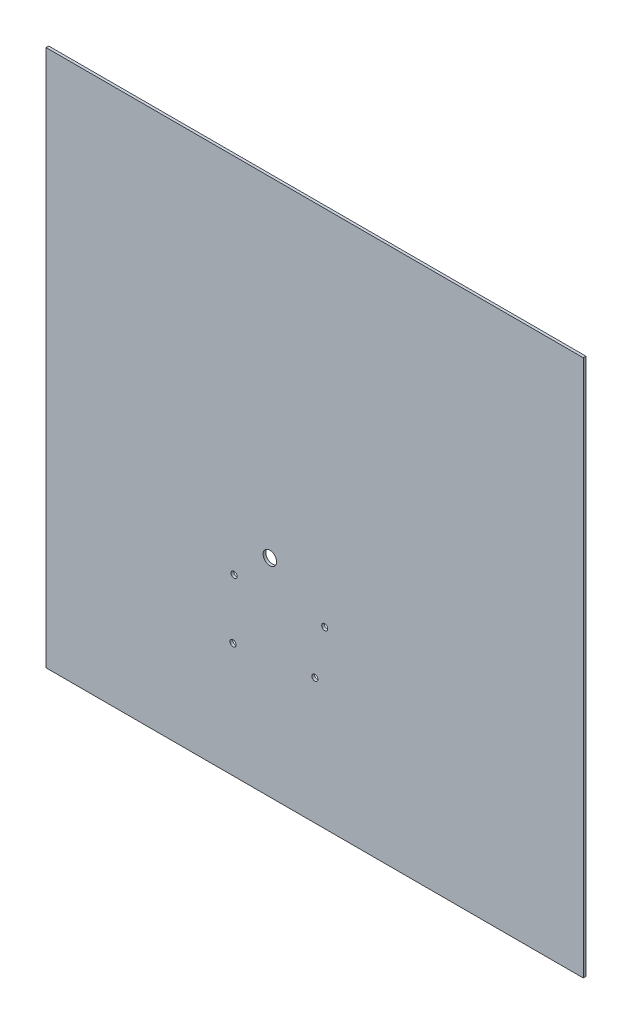
ISO-10303-21;
HEADER;
FILE_DESCRIPTION(('STEP AP214'),'2;1');
FILE_NAME('part.step','',(''),(''),'','','');
FILE_SCHEMA(('AUTOMOTIVE_DESIGN { 1 0 10303 214 1 1 1 1 }'));
ENDSEC;
DATA;
#1=APPLICATION_CONTEXT('core data for automotive mechanical design processes');
#2=APPLICATION_PROTOCOL_DEFINITION('international standard','automotive_design',2000,#1);
#3=PRODUCT_CONTEXT('',#1,'mechanical');
#4=PRODUCT('Part','Part','',(#3));
#5=PRODUCT_RELATED_PRODUCT_CATEGORY('part','',(#4));
#6=PRODUCT_DEFINITION_FORMATION('','',#4);
#7=PRODUCT_DEFINITION_CONTEXT('part definition',#1,'design');
#8=PRODUCT_DEFINITION('design','',#6,#7);
#9=PRODUCT_DEFINITION_SHAPE('','',#8);
#10=(LENGTH_UNIT() NAMED_UNIT(*) SI_UNIT(.MILLI.,.METRE.));
#11=(NAMED_UNIT(*) PLANE_ANGLE_UNIT() SI_UNIT($,.RADIAN.));
#12=(NAMED_UNIT(*) SI_UNIT($,.STERADIAN.) SOLID_ANGLE_UNIT());
#13=UNCERTAINTY_MEASURE_WITH_UNIT(LENGTH_MEASURE(1.E-05),#10,'distance_accuracy_value','');
#14=(GEOMETRIC_REPRESENTATION_CONTEXT(3) GLOBAL_UNCERTAINTY_ASSIGNED_CONTEXT((#13)) GLOBAL_UNIT_ASSIGNED_CONTEXT((#10,
#11,#12)) REPRESENTATION_CONTEXT('',''));
#15=CARTESIAN_POINT('',(0.,0.,0.));
#16=DIRECTION('',(0.,0.,1.));
#17=DIRECTION('',(1.,0.,0.));
#18=AXIS2_PLACEMENT_3D('',#15,#16,#17);
#19=CARTESIAN_POINT('',(0.,0.,2.));
#20=DIRECTION('',(0.,0.,1.));
#21=DIRECTION('',(1.,0.,0.));
#22=AXIS2_PLACEMENT_3D('',#19,#20,#21);
#23=PLANE('',#22);
#24=CARTESIAN_POINT('',(-22.9728776967185,108.371759905907,2.));
#25=DIRECTION('',(0.,0.,1.));
#26=DIRECTION('',(1.,0.,0.));
#27=AXIS2_PLACEMENT_3D('',#24,#25,#26);
#28=CIRCLE('',#27,2.25);
#29=CARTESIAN_POINT('',(-20.7228776967185,108.371759905907,2.));
#30=VERTEX_POINT('',#29);
#31=EDGE_CURVE('E152',#30,#30,#28,.T.);
#32=ORIENTED_EDGE('',*,*,#31,.F.);
#33=EDGE_LOOP('',(#32));
#34=FACE_BOUND('',#33,.T.);
#35=CARTESIAN_POINT('',(45.3104556366148,152.864864864865,2.));
#36=DIRECTION('',(0.,0.,1.));
#37=DIRECTION('',(1.,0.,0.));
#38=AXIS2_PLACEMENT_3D('',#35,#36,#37);
#39=CIRCLE('',#38,2.25);
#40=CARTESIAN_POINT('',(47.5604556366148,152.864864864865,2.));
#41=VERTEX_POINT('',#40);
#42=EDGE_CURVE('E136',#41,#41,#39,.T.);
#43=ORIENTED_EDGE('',*,*,#42,.F.);
#44=EDGE_LOOP('',(#43));
#45=FACE_BOUND('',#44,.T.);
#46=DIRECTION('',(0.,-1.,0.));
#47=VECTOR('',#46,1.);
#48=CARTESIAN_POINT('',(-162.189544363385,422.864864864865,2.));
#49=LINE('',#48,#47);
#50=CARTESIAN_POINT('',(-162.189544363385,422.864864864865,2.));
#51=VERTEX_POINT('',#50);
#52=CARTESIAN_POINT('',(-162.189544363385,22.8648648648649,2.));
#53=VERTEX_POINT('',#52);
#54=EDGE_CURVE('E94',#51,#53,#49,.T.);
#55=ORIENTED_EDGE('',*,*,#54,.T.);
#56=DIRECTION('',(1.,0.,0.));
#57=VECTOR('',#56,1.);
#58=CARTESIAN_POINT('',(-162.189544363385,22.8648648648649,2.));
#59=LINE('',#58,#57);
#60=CARTESIAN_POINT('',(237.810455636615,22.8648648648649,2.));
#61=VERTEX_POINT('',#60);
#62=EDGE_CURVE('E89',#53,#61,#59,.T.);
#63=ORIENTED_EDGE('',*,*,#62,.T.);
#64=DIRECTION('',(0.,1.,0.));
#65=VECTOR('',#64,1.);
#66=CARTESIAN_POINT('',(237.810455636615,422.864864864865,2.));
#67=LINE('',#66,#65);
#68=CARTESIAN_POINT('',(237.810455636615,422.864864864865,2.));
#69=VERTEX_POINT('',#68);
#70=EDGE_CURVE('E92',#61,#69,#67,.T.);
#71=ORIENTED_EDGE('',*,*,#70,.T.);
#72=DIRECTION('',(-1.,0.,0.));
#73=VECTOR('',#72,1.);
#74=CARTESIAN_POINT('',(-162.189544363385,422.864864864865,2.));
#75=LINE('',#74,#73);
#76=EDGE_CURVE('E59',#69,#51,#75,.T.);
#77=ORIENTED_EDGE('',*,*,#76,.T.);
#78=EDGE_LOOP('',(#55,#63,#71,#77));
#79=FACE_BOUND('',#78,.T.);
#80=CARTESIAN_POINT('',(-22.1895443633852,152.864864864865,2.));
#81=DIRECTION('',(0.,0.,1.));
#82=DIRECTION('',(1.,0.,0.));
#83=AXIS2_PLACEMENT_3D('',#80,#81,#82);
#84=CIRCLE('',#83,2.25);
#85=CARTESIAN_POINT('',(-19.9395443633852,152.864864864865,2.));
#86=VERTEX_POINT('',#85);
#87=EDGE_CURVE('E114',#86,#86,#84,.T.);
#88=ORIENTED_EDGE('',*,*,#87,.F.);
#89=EDGE_LOOP('',(#88));
#90=FACE_BOUND('',#89,.T.);
#91=CARTESIAN_POINT('',(37.9742726828477,116.599448561328,2.));
#92=DIRECTION('',(0.,0.,1.));
#93=DIRECTION('',(1.,0.,0.));
#94=AXIS2_PLACEMENT_3D('',#91,#92,#93);
#95=CIRCLE('',#94,2.25);
#96=CARTESIAN_POINT('',(40.2242726828477,116.599448561328,2.));
#97=VERTEX_POINT('',#96);
#98=EDGE_CURVE('E144',#97,#97,#95,.T.);
#99=ORIENTED_EDGE('',*,*,#98,.F.);
#100=EDGE_LOOP('',(#99));
#101=FACE_BOUND('',#100,.T.);
#102=CARTESIAN_POINT('',(4.44749267365187,177.081971584858,2.));
#103=DIRECTION('',(0.,0.,1.));
#104=DIRECTION('',(1.,0.,0.));
#105=AXIS2_PLACEMENT_3D('',#102,#103,#104);
#106=CIRCLE('',#105,5.);
#107=CARTESIAN_POINT('',(9.44749267365187,177.081971584858,2.));
#108=VERTEX_POINT('',#107);
#109=EDGE_CURVE('E160',#108,#108,#106,.T.);
#110=ORIENTED_EDGE('',*,*,#109,.F.);
#111=EDGE_LOOP('',(#110));
#112=FACE_BOUND('',#111,.T.);
#113=ADVANCED_FACE('F41',(#34,#45,#79,#90,#101,#112),#23,.T.);
#114=CARTESIAN_POINT('',(0.,0.,0.));
#115=DIRECTION('',(0.,0.,1.));
#116=DIRECTION('',(1.,0.,0.));
#117=AXIS2_PLACEMENT_3D('',#114,#115,#116);
#118=PLANE('',#117);
#119=DIRECTION('',(0.,-1.,0.));
#120=VECTOR('',#119,1.);
#121=CARTESIAN_POINT('',(-162.189544363385,422.864864864865,0.));
#122=LINE('',#121,#120);
#123=CARTESIAN_POINT('',(-162.189544363385,422.864864864865,0.));
#124=VERTEX_POINT('',#123);
#125=CARTESIAN_POINT('',(-162.189544363385,22.8648648648649,0.));
#126=VERTEX_POINT('',#125);
#127=EDGE_CURVE('E110',#124,#126,#122,.T.);
#128=ORIENTED_EDGE('',*,*,#127,.F.);
#129=DIRECTION('',(-1.,0.,0.));
#130=VECTOR('',#129,1.);
#131=CARTESIAN_POINT('',(-162.189544363385,422.864864864865,0.));
#132=LINE('',#131,#130);
#133=CARTESIAN_POINT('',(237.810455636615,422.864864864865,0.));
#134=VERTEX_POINT('',#133);
#135=EDGE_CURVE('E82',#134,#124,#132,.T.);
#136=ORIENTED_EDGE('',*,*,#135,.F.);
#137=DIRECTION('',(0.,1.,0.));
#138=VECTOR('',#137,1.);
#139=CARTESIAN_POINT('',(237.810455636615,422.864864864865,0.));
#140=LINE('',#139,#138);
#141=CARTESIAN_POINT('',(237.810455636615,22.8648648648649,0.));
#142=VERTEX_POINT('',#141);
#143=EDGE_CURVE('E76',#142,#134,#140,.T.);
#144=ORIENTED_EDGE('',*,*,#143,.F.);
#145=DIRECTION('',(1.,0.,0.));
#146=VECTOR('',#145,1.);
#147=CARTESIAN_POINT('',(-162.189544363385,22.8648648648649,0.));
#148=LINE('',#147,#146);
#149=EDGE_CURVE('E99',#126,#142,#148,.T.);
#150=ORIENTED_EDGE('',*,*,#149,.F.);
#151=EDGE_LOOP('',(#128,#136,#144,#150));
#152=FACE_BOUND('',#151,.T.);
#153=CARTESIAN_POINT('',(-22.1895443633852,152.864864864865,0.));
#154=DIRECTION('',(0.,0.,1.));
#155=DIRECTION('',(1.,0.,0.));
#156=AXIS2_PLACEMENT_3D('',#153,#154,#155);
#157=CIRCLE('',#156,2.25);
#158=CARTESIAN_POINT('',(-19.9395443633852,152.864864864865,0.));
#159=VERTEX_POINT('',#158);
#160=EDGE_CURVE('E132',#159,#159,#157,.T.);
#161=ORIENTED_EDGE('',*,*,#160,.T.);
#162=EDGE_LOOP('',(#161));
#163=FACE_BOUND('',#162,.T.);
#164=CARTESIAN_POINT('',(45.3104556366148,152.864864864865,0.));
#165=DIRECTION('',(0.,0.,1.));
#166=DIRECTION('',(1.,0.,0.));
#167=AXIS2_PLACEMENT_3D('',#164,#165,#166);
#168=CIRCLE('',#167,2.25);
#169=CARTESIAN_POINT('',(47.5604556366148,152.864864864865,0.));
#170=VERTEX_POINT('',#169);
#171=EDGE_CURVE('E140',#170,#170,#168,.T.);
#172=ORIENTED_EDGE('',*,*,#171,.T.);
#173=EDGE_LOOP('',(#172));
#174=FACE_BOUND('',#173,.T.);
#175=CARTESIAN_POINT('',(37.9742726828477,116.599448561328,0.));
#176=DIRECTION('',(0.,0.,1.));
#177=DIRECTION('',(1.,0.,0.));
#178=AXIS2_PLACEMENT_3D('',#175,#176,#177);
#179=CIRCLE('',#178,2.25);
#180=CARTESIAN_POINT('',(40.2242726828477,116.599448561328,0.));
#181=VERTEX_POINT('',#180);
#182=EDGE_CURVE('E148',#181,#181,#179,.T.);
#183=ORIENTED_EDGE('',*,*,#182,.T.);
#184=EDGE_LOOP('',(#183));
#185=FACE_BOUND('',#184,.T.);
#186=CARTESIAN_POINT('',(-22.9728776967185,108.371759905907,0.));
#187=DIRECTION('',(0.,0.,1.));
#188=DIRECTION('',(1.,0.,0.));
#189=AXIS2_PLACEMENT_3D('',#186,#187,#188);
#190=CIRCLE('',#189,2.25);
#191=CARTESIAN_POINT('',(-20.7228776967185,108.371759905907,0.));
#192=VERTEX_POINT('',#191);
#193=EDGE_CURVE('E156',#192,#192,#190,.T.);
#194=ORIENTED_EDGE('',*,*,#193,.T.);
#195=EDGE_LOOP('',(#194));
#196=FACE_BOUND('',#195,.T.);
#197=CARTESIAN_POINT('',(4.44749267365187,177.081971584858,0.));
#198=DIRECTION('',(0.,0.,1.));
#199=DIRECTION('',(1.,0.,0.));
#200=AXIS2_PLACEMENT_3D('',#197,#198,#199);
#201=CIRCLE('',#200,5.);
#202=CARTESIAN_POINT('',(9.44749267365187,177.081971584858,0.));
#203=VERTEX_POINT('',#202);
#204=EDGE_CURVE('E164',#203,#203,#201,.T.);
#205=ORIENTED_EDGE('',*,*,#204,.T.);
#206=EDGE_LOOP('',(#205));
#207=FACE_BOUND('',#206,.T.);
#208=ADVANCED_FACE('F127',(#152,#163,#174,#185,#196,#207),#118,.F.);
#209=CARTESIAN_POINT('',(-162.189544363385,422.864864864865,2.));
#210=DIRECTION('',(1.,0.,0.));
#211=DIRECTION('',(0.,1.,0.));
#212=AXIS2_PLACEMENT_3D('',#209,#210,#211);
#213=PLANE('',#212);
#214=ORIENTED_EDGE('',*,*,#127,.T.);
#215=DIRECTION('',(0.,0.,-1.));
#216=VECTOR('',#215,1.);
#217=CARTESIAN_POINT('',(-162.189544363385,22.8648648648649,2.));
#218=LINE('',#217,#216);
#219=EDGE_CURVE('E11',#53,#126,#218,.T.);
#220=ORIENTED_EDGE('',*,*,#219,.F.);
#221=ORIENTED_EDGE('',*,*,#54,.F.);
#222=DIRECTION('',(0.,0.,-1.));
#223=VECTOR('',#222,1.);
#224=CARTESIAN_POINT('',(-162.189544363385,422.864864864865,2.));
#225=LINE('',#224,#223);
#226=EDGE_CURVE('E106',#51,#124,#225,.T.);
#227=ORIENTED_EDGE('',*,*,#226,.T.);
#228=EDGE_LOOP('',(#214,#220,#221,#227));
#229=FACE_BOUND('',#228,.T.);
#230=ADVANCED_FACE('F43',(#229),#213,.F.);
#231=CARTESIAN_POINT('',(-162.189544363385,22.8648648648649,2.));
#232=DIRECTION('',(0.,1.,0.));
#233=DIRECTION('',(0.,0.,1.));
#234=AXIS2_PLACEMENT_3D('',#231,#232,#233);
#235=PLANE('',#234);
#236=ORIENTED_EDGE('',*,*,#149,.T.);
#237=DIRECTION('',(0.,0.,-1.));
#238=VECTOR('',#237,1.);
#239=CARTESIAN_POINT('',(237.810455636615,22.8648648648649,2.));
#240=LINE('',#239,#238);
#241=EDGE_CURVE('E51',#61,#142,#240,.T.);
#242=ORIENTED_EDGE('',*,*,#241,.F.);
#243=ORIENTED_EDGE('',*,*,#62,.F.);
#244=ORIENTED_EDGE('',*,*,#219,.T.);
#245=EDGE_LOOP('',(#236,#242,#243,#244));
#246=FACE_BOUND('',#245,.T.);
#247=ADVANCED_FACE('F98',(#246),#235,.F.);
#248=CARTESIAN_POINT('',(237.810455636615,422.864864864865,2.));
#249=DIRECTION('',(-1.,0.,0.));
#250=DIRECTION('',(0.,-1.,0.));
#251=AXIS2_PLACEMENT_3D('',#248,#249,#250);
#252=PLANE('',#251);
#253=ORIENTED_EDGE('',*,*,#143,.T.);
#254=DIRECTION('',(0.,0.,-1.));
#255=VECTOR('',#254,1.);
#256=CARTESIAN_POINT('',(237.810455636615,422.864864864865,2.));
#257=LINE('',#256,#255);
#258=EDGE_CURVE('E101',#69,#134,#257,.T.);
#259=ORIENTED_EDGE('',*,*,#258,.F.);
#260=ORIENTED_EDGE('',*,*,#70,.F.);
#261=ORIENTED_EDGE('',*,*,#241,.T.);
#262=EDGE_LOOP('',(#253,#259,#260,#261));
#263=FACE_BOUND('',#262,.T.);
#264=ADVANCED_FACE('F102',(#263),#252,.F.);
#265=CARTESIAN_POINT('',(-162.189544363385,422.864864864865,2.));
#266=DIRECTION('',(0.,-1.,0.));
#267=DIRECTION('',(0.,0.,-1.));
#268=AXIS2_PLACEMENT_3D('',#265,#266,#267);
#269=PLANE('',#268);
#270=ORIENTED_EDGE('',*,*,#135,.T.);
#271=ORIENTED_EDGE('',*,*,#226,.F.);
#272=ORIENTED_EDGE('',*,*,#76,.F.);
#273=ORIENTED_EDGE('',*,*,#258,.T.);
#274=EDGE_LOOP('',(#270,#271,#272,#273));
#275=FACE_BOUND('',#274,.T.);
#276=ADVANCED_FACE('F124',(#275),#269,.F.);
#277=CARTESIAN_POINT('',(-22.1895443633852,152.864864864865,2.));
#278=DIRECTION('',(0.,0.,-1.));
#279=DIRECTION('',(-1.,0.,0.));
#280=AXIS2_PLACEMENT_3D('',#277,#278,#279);
#281=CYLINDRICAL_SURFACE('',#280,2.25);
#282=ORIENTED_EDGE('',*,*,#87,.T.);
#283=EDGE_LOOP('',(#282));
#284=FACE_BOUND('',#283,.T.);
#285=ORIENTED_EDGE('',*,*,#160,.F.);
#286=EDGE_LOOP('',(#285));
#287=FACE_BOUND('',#286,.T.);
#288=ADVANCED_FACE('F185',(#284,#287),#281,.F.);
#289=CARTESIAN_POINT('',(45.3104556366148,152.864864864865,2.));
#290=DIRECTION('',(0.,0.,-1.));
#291=DIRECTION('',(-1.,0.,0.));
#292=AXIS2_PLACEMENT_3D('',#289,#290,#291);
#293=CYLINDRICAL_SURFACE('',#292,2.25);
#294=ORIENTED_EDGE('',*,*,#42,.T.);
#295=EDGE_LOOP('',(#294));
#296=FACE_BOUND('',#295,.T.);
#297=ORIENTED_EDGE('',*,*,#171,.F.);
#298=EDGE_LOOP('',(#297));
#299=FACE_BOUND('',#298,.T.);
#300=ADVANCED_FACE('F235',(#296,#299),#293,.F.);
#301=CARTESIAN_POINT('',(37.9742726828477,116.599448561328,2.));
#302=DIRECTION('',(0.,0.,-1.));
#303=DIRECTION('',(-1.,0.,0.));
#304=AXIS2_PLACEMENT_3D('',#301,#302,#303);
#305=CYLINDRICAL_SURFACE('',#304,2.25);
#306=ORIENTED_EDGE('',*,*,#98,.T.);
#307=EDGE_LOOP('',(#306));
#308=FACE_BOUND('',#307,.T.);
#309=ORIENTED_EDGE('',*,*,#182,.F.);
#310=EDGE_LOOP('',(#309));
#311=FACE_BOUND('',#310,.T.);
#312=ADVANCED_FACE('F243',(#308,#311),#305,.F.);
#313=CARTESIAN_POINT('',(-22.9728776967185,108.371759905907,2.));
#314=DIRECTION('',(0.,0.,-1.));
#315=DIRECTION('',(-1.,0.,0.));
#316=AXIS2_PLACEMENT_3D('',#313,#314,#315);
#317=CYLINDRICAL_SURFACE('',#316,2.25);
#318=ORIENTED_EDGE('',*,*,#31,.T.);
#319=EDGE_LOOP('',(#318));
#320=FACE_BOUND('',#319,.T.);
#321=ORIENTED_EDGE('',*,*,#193,.F.);
#322=EDGE_LOOP('',(#321));
#323=FACE_BOUND('',#322,.T.);
#324=ADVANCED_FACE('F251',(#320,#323),#317,.F.);
#325=CARTESIAN_POINT('',(4.44749267365187,177.081971584858,2.));
#326=DIRECTION('',(0.,0.,-1.));
#327=DIRECTION('',(-1.,0.,0.));
#328=AXIS2_PLACEMENT_3D('',#325,#326,#327);
#329=CYLINDRICAL_SURFACE('',#328,5.);
#330=ORIENTED_EDGE('',*,*,#109,.T.);
#331=EDGE_LOOP('',(#330));
#332=FACE_BOUND('',#331,.T.);
#333=ORIENTED_EDGE('',*,*,#204,.F.);
#334=EDGE_LOOP('',(#333));
#335=FACE_BOUND('',#334,.T.);
#336=ADVANCED_FACE('F172',(#332,#335),#329,.F.);
#337=CLOSED_SHELL('',(#113,#208,#230,#247,#264,#276,#288,#300,#312,#324,#336));
#338=MANIFOLD_SOLID_BREP('B2',#337);
#339=ADVANCED_BREP_SHAPE_REPRESENTATION('',(#18,#338),#14);
#340=SHAPE_DEFINITION_REPRESENTATION(#9,#339);
ENDSEC;
END-ISO-10303-21;
